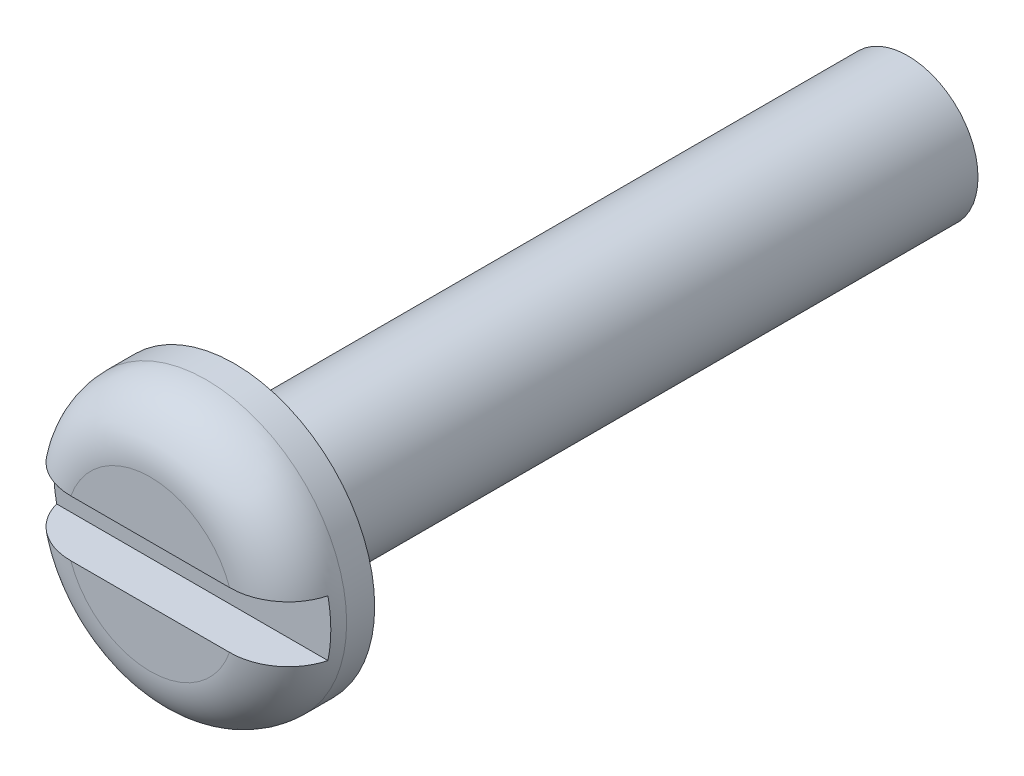
ISO-10303-21;
HEADER;
FILE_DESCRIPTION(('STEP AP214'),'2;1');
FILE_NAME('part.step','',(''),(''),'','','');
FILE_SCHEMA(('AUTOMOTIVE_DESIGN { 1 0 10303 214 1 1 1 1 }'));
ENDSEC;
DATA;
#1=APPLICATION_CONTEXT('core data for automotive mechanical design processes');
#2=APPLICATION_PROTOCOL_DEFINITION('international standard','automotive_design',2000,#1);
#3=PRODUCT_CONTEXT('',#1,'mechanical');
#4=PRODUCT('Part','Part','',(#3));
#5=PRODUCT_RELATED_PRODUCT_CATEGORY('part','',(#4));
#6=PRODUCT_DEFINITION_FORMATION('','',#4);
#7=PRODUCT_DEFINITION_CONTEXT('part definition',#1,'design');
#8=PRODUCT_DEFINITION('design','',#6,#7);
#9=PRODUCT_DEFINITION_SHAPE('','',#8);
#10=(LENGTH_UNIT() NAMED_UNIT(*) SI_UNIT(.MILLI.,.METRE.));
#11=(NAMED_UNIT(*) PLANE_ANGLE_UNIT() SI_UNIT($,.RADIAN.));
#12=(NAMED_UNIT(*) SI_UNIT($,.STERADIAN.) SOLID_ANGLE_UNIT());
#13=UNCERTAINTY_MEASURE_WITH_UNIT(LENGTH_MEASURE(1.E-05),#10,'distance_accuracy_value','');
#14=(GEOMETRIC_REPRESENTATION_CONTEXT(3) GLOBAL_UNCERTAINTY_ASSIGNED_CONTEXT((#13)) GLOBAL_UNIT_ASSIGNED_CONTEXT((#10,
#11,#12)) REPRESENTATION_CONTEXT('',''));
#15=CARTESIAN_POINT('',(0.,0.,0.));
#16=DIRECTION('',(0.,0.,1.));
#17=DIRECTION('',(1.,0.,0.));
#18=AXIS2_PLACEMENT_3D('',#15,#16,#17);
#19=CARTESIAN_POINT('',(0.,0.,1.5));
#20=DIRECTION('',(0.,0.,1.));
#21=DIRECTION('',(1.,0.,0.));
#22=AXIS2_PLACEMENT_3D('',#19,#20,#21);
#23=PLANE('',#22);
#24=DIRECTION('',(-1.,0.,0.));
#25=VECTOR('',#24,1.);
#26=CARTESIAN_POINT('',(-3.10291366643896,0.5,1.5));
#27=LINE('',#26,#25);
#28=CARTESIAN_POINT('',(1.41421356237309,0.5,1.5));
#29=VERTEX_POINT('',#28);
#30=CARTESIAN_POINT('',(-1.41421356237309,0.5,1.5));
#31=VERTEX_POINT('',#30);
#32=EDGE_CURVE('E103',#29,#31,#27,.T.);
#33=ORIENTED_EDGE('',*,*,#32,.F.);
#34=CARTESIAN_POINT('',(0.,0.,1.5));
#35=DIRECTION('',(0.,0.,1.));
#36=DIRECTION('',(1.,0.,0.));
#37=AXIS2_PLACEMENT_3D('',#34,#35,#36);
#38=CIRCLE('',#37,1.5);
#39=EDGE_CURVE('E109',#29,#31,#38,.T.);
#40=ORIENTED_EDGE('',*,*,#39,.T.);
#41=EDGE_LOOP('',(#33,#40));
#42=FACE_BOUND('',#41,.T.);
#43=ADVANCED_FACE('F41',(#42),#23,.T.);
#44=CARTESIAN_POINT('',(0.,0.,-12.));
#45=DIRECTION('',(0.,0.,1.));
#46=DIRECTION('',(1.,0.,0.));
#47=AXIS2_PLACEMENT_3D('',#44,#45,#46);
#48=CYLINDRICAL_SURFACE('',#47,1.25);
#49=CARTESIAN_POINT('',(0.,0.,-12.));
#50=DIRECTION('',(0.,0.,1.));
#51=DIRECTION('',(1.,0.,0.));
#52=AXIS2_PLACEMENT_3D('',#49,#50,#51);
#53=CIRCLE('',#52,1.25);
#54=CARTESIAN_POINT('',(1.25,0.,-12.));
#55=VERTEX_POINT('',#54);
#56=EDGE_CURVE('E110',#55,#55,#53,.T.);
#57=ORIENTED_EDGE('',*,*,#56,.T.);
#58=EDGE_LOOP('',(#57));
#59=FACE_BOUND('',#58,.T.);
#60=CARTESIAN_POINT('',(0.,0.,0.));
#61=DIRECTION('',(0.,0.,1.));
#62=DIRECTION('',(1.,0.,0.));
#63=AXIS2_PLACEMENT_3D('',#60,#61,#62);
#64=CIRCLE('',#63,1.25);
#65=CARTESIAN_POINT('',(1.25,0.,0.));
#66=VERTEX_POINT('',#65);
#67=EDGE_CURVE('E117',#66,#66,#64,.T.);
#68=ORIENTED_EDGE('',*,*,#67,.F.);
#69=EDGE_LOOP('',(#68));
#70=FACE_BOUND('',#69,.T.);
#71=ADVANCED_FACE('F176',(#59,#70),#48,.T.);
#72=CARTESIAN_POINT('',(0.,0.,-12.));
#73=DIRECTION('',(0.,0.,1.));
#74=DIRECTION('',(1.,0.,0.));
#75=AXIS2_PLACEMENT_3D('',#72,#73,#74);
#76=PLANE('',#75);
#77=ORIENTED_EDGE('',*,*,#56,.F.);
#78=EDGE_LOOP('',(#77));
#79=FACE_BOUND('',#78,.T.);
#80=ADVANCED_FACE('F178',(#79),#76,.F.);
#81=CARTESIAN_POINT('',(0.,0.,1.5));
#82=DIRECTION('',(0.,0.,-1.));
#83=DIRECTION('',(-1.,0.,0.));
#84=AXIS2_PLACEMENT_3D('',#81,#82,#83);
#85=CYLINDRICAL_SURFACE('',#84,2.5);
#86=CARTESIAN_POINT('',(0.,0.,0.5));
#87=DIRECTION('',(0.,0.,1.));
#88=DIRECTION('',(1.,0.,0.));
#89=AXIS2_PLACEMENT_3D('',#86,#87,#88);
#90=CIRCLE('',#89,2.5);
#91=CARTESIAN_POINT('',(2.5,0.,0.5));
#92=VERTEX_POINT('',#91);
#93=EDGE_CURVE('E115',#92,#92,#90,.F.);
#94=ORIENTED_EDGE('',*,*,#93,.T.);
#95=EDGE_LOOP('',(#94));
#96=FACE_BOUND('',#95,.T.);
#97=CARTESIAN_POINT('',(0.,0.,0.));
#98=DIRECTION('',(0.,0.,1.));
#99=DIRECTION('',(1.,0.,0.));
#100=AXIS2_PLACEMENT_3D('',#97,#98,#99);
#101=CIRCLE('',#100,2.5);
#102=CARTESIAN_POINT('',(2.5,0.,0.));
#103=VERTEX_POINT('',#102);
#104=EDGE_CURVE('E163',#103,#103,#101,.T.);
#105=ORIENTED_EDGE('',*,*,#104,.T.);
#106=EDGE_LOOP('',(#105));
#107=FACE_BOUND('',#106,.T.);
#108=ADVANCED_FACE('F184',(#96,#107),#85,.T.);
#109=DIRECTION('',(1.,0.,0.));
#110=VECTOR('',#109,1.);
#111=CARTESIAN_POINT('',(-3.10291366643896,-0.5,1.5));
#112=LINE('',#111,#110);
#113=CARTESIAN_POINT('',(-1.41421356237309,-0.5,1.5));
#114=VERTEX_POINT('',#113);
#115=CARTESIAN_POINT('',(1.41421356237309,-0.5,1.5));
#116=VERTEX_POINT('',#115);
#117=EDGE_CURVE('E89',#114,#116,#112,.T.);
#118=ORIENTED_EDGE('',*,*,#117,.F.);
#119=EDGE_CURVE('E101',#114,#116,#38,.T.);
#120=ORIENTED_EDGE('',*,*,#119,.T.);
#121=EDGE_LOOP('',(#118,#120));
#122=FACE_BOUND('',#121,.T.);
#123=ADVANCED_FACE('F100',(#122),#23,.T.);
#124=CARTESIAN_POINT('',(0.,0.,0.));
#125=DIRECTION('',(0.,0.,1.));
#126=DIRECTION('',(1.,0.,0.));
#127=AXIS2_PLACEMENT_3D('',#124,#125,#126);
#128=PLANE('',#127);
#129=ORIENTED_EDGE('',*,*,#67,.T.);
#130=EDGE_LOOP('',(#129));
#131=FACE_BOUND('',#130,.T.);
#132=ORIENTED_EDGE('',*,*,#104,.F.);
#133=EDGE_LOOP('',(#132));
#134=FACE_BOUND('',#133,.T.);
#135=ADVANCED_FACE('F173',(#131,#134),#128,.F.);
#136=CARTESIAN_POINT('',(0.,0.,0.5));
#137=DIRECTION('',(0.,0.,1.));
#138=DIRECTION('',(1.,0.,0.));
#139=AXIS2_PLACEMENT_3D('',#136,#137,#138);
#140=TOROIDAL_SURFACE('',#139,1.5,1.);
#141=CARTESIAN_POINT('',(0.,0.5,0.5));
#142=CARTESIAN_POINT('',(0.00121710493622152,0.5,0.501721284170827));
#143=CARTESIAN_POINT('',(0.00243426704448471,0.5,0.503442610685275));
#144=CARTESIAN_POINT('',(0.100816916781004,0.5,0.642569506493524));
#145=CARTESIAN_POINT('',(0.19848511571247,0.5,0.780124040271605));
#146=CARTESIAN_POINT('',(0.362031298498653,0.5,0.971868797124672));
#147=CARTESIAN_POINT('',(0.4192098250689,0.5,1.03320610876618));
#148=CARTESIAN_POINT('',(0.540770271724347,0.5,1.14817563642421));
#149=CARTESIAN_POINT('',(0.605135463772196,0.5,1.20182510822939));
#150=CARTESIAN_POINT('',(0.729814156922116,0.5,1.29008181339765));
#151=CARTESIAN_POINT('',(0.788920336433022,0.5,1.32637714685597));
#152=CARTESIAN_POINT('',(0.912013054850255,0.5,1.38986957810976));
#153=CARTESIAN_POINT('',(0.976006791325585,0.5,1.41705292727275));
#154=CARTESIAN_POINT('',(1.10800568500184,0.5,1.46070915202017));
#155=CARTESIAN_POINT('',(1.17603152286702,0.5,1.47712044798345));
#156=CARTESIAN_POINT('',(1.31392262036084,0.5,1.49763885150411));
#157=CARTESIAN_POINT('',(1.38378673097097,0.5,1.50175346910928));
#158=CARTESIAN_POINT('',(1.52003733341302,0.5,1.49698123372873));
#159=CARTESIAN_POINT('',(1.58644259382081,0.5,1.4886536489599));
#160=CARTESIAN_POINT('',(1.71657123248023,0.5,1.45981594062758));
#161=CARTESIAN_POINT('',(1.78029543591354,0.5,1.43930959528109));
#162=CARTESIAN_POINT('',(1.89706279587225,0.5,1.38893401908855));
#163=CARTESIAN_POINT('',(1.95054994400044,0.5,1.36009059230055));
#164=CARTESIAN_POINT('',(2.05157198720063,0.5,1.29339223216359));
#165=CARTESIAN_POINT('',(2.09910918821342,0.5,1.25554080652784));
#166=CARTESIAN_POINT('',(2.18445035545179,0.5,1.17398529229688));
#167=CARTESIAN_POINT('',(2.22261878662205,0.5,1.13066203234144));
#168=CARTESIAN_POINT('',(2.29090494932317,0.5,1.0380777244131));
#169=CARTESIAN_POINT('',(2.32102415140193,0.5,0.988817763430664));
#170=CARTESIAN_POINT('',(2.3715692607391,0.5,0.887160113287818));
#171=CARTESIAN_POINT('',(2.39222774369869,0.5,0.834877944261207));
#172=CARTESIAN_POINT('',(2.42434741686294,0.5,0.727556808609749));
#173=CARTESIAN_POINT('',(2.43580869998492,0.5,0.672517869841913));
#174=CARTESIAN_POINT('',(2.44908815114489,0.5,0.562001592991649));
#175=CARTESIAN_POINT('',(2.45102713889442,0.5,0.506538739255358));
#176=CARTESIAN_POINT('',(2.44553181756062,0.5,0.396091964343422));
#177=CARTESIAN_POINT('',(2.43809968018801,0.5,0.341107935175559));
#178=CARTESIAN_POINT('',(2.41413245274094,0.5,0.233358149438304));
#179=CARTESIAN_POINT('',(2.3976284357353,0.5,0.180585478880079));
#180=CARTESIAN_POINT('',(2.3560377030093,0.5,0.0785263038597564));
#181=CARTESIAN_POINT('',(2.33094788255322,0.5,0.0292410682895098));
#182=CARTESIAN_POINT('',(2.27277228964982,0.5,-0.0647207161002362));
#183=CARTESIAN_POINT('',(2.23964844613928,0.5,-0.109373831626207));
#184=CARTESIAN_POINT('',(2.18480553519818,0.5,-0.171751937348136));
#185=CARTESIAN_POINT('',(2.16565272100757,0.5,-0.191787759705729));
#186=CARTESIAN_POINT('',(2.12576099700987,0.5,-0.230210938042076));
#187=CARTESIAN_POINT('',(2.10502216919978,0.5,-0.248598379135615));
#188=CARTESIAN_POINT('',(2.08355429848249,0.5,-0.266111052226493));
#189=B_SPLINE_CURVE_WITH_KNOTS('',3,(#141,#142,#143,#144,#145,#146,#147,#148,#149,#150,#151,
#152,#153,#154,#155,#156,#157,#158,#159,#160,#161,#162,#163,#164,#165,#166,#167,#168,#169,#170,
#171,#172,#173,#174,#175,#176,#177,#178,#179,#180,#181,#182,#183,#184,#185,#186,#187,#188),
.UNSPECIFIED.,.F.,.F.,(4,2,2,2,2,2,2,2,2,2,2,2,2,2,2,2,2,2,2,2,2,2,2,4),(0.,0.00632455532040701,
0.511177739597177,0.762249343851845,1.01274826726215,1.2201609245296,1.42788514264277,
1.63678672953122,1.84556070619857,2.04522840835514,2.24483419993125,2.4262154029256,
2.60752609134629,2.77989258609502,2.95222756891491,3.12006252454541,3.28789578455456,
3.45359395953182,3.61925374185417,3.7843496092279,3.94950524056469,4.11545933900516,
4.19853060311015,4.28159757532561),.UNSPECIFIED.);
#190=CARTESIAN_POINT('',(2.41707209442655,0.5,0.75));
#191=VERTEX_POINT('',#190);
#192=EDGE_CURVE('E11',#191,#29,#189,.F.);
#193=ORIENTED_EDGE('',*,*,#192,.F.);
#194=CARTESIAN_POINT('',(0.,0.,0.75));
#195=DIRECTION('',(0.,0.,-1.));
#196=DIRECTION('',(-1.,0.,0.));
#197=AXIS2_PLACEMENT_3D('',#194,#195,#196);
#198=CIRCLE('',#197,2.46824583655185);
#199=CARTESIAN_POINT('',(2.41707209442655,-0.5,0.75));
#200=VERTEX_POINT('',#199);
#201=EDGE_CURVE('E125',#200,#191,#198,.F.);
#202=ORIENTED_EDGE('',*,*,#201,.F.);
#203=CARTESIAN_POINT('',(0.,-0.5,0.5));
#204=CARTESIAN_POINT('',(0.00121710493622152,-0.5,0.501721284170827));
#205=CARTESIAN_POINT('',(0.00243426704448471,-0.5,0.503442610685275));
#206=CARTESIAN_POINT('',(0.100816916781004,-0.5,0.642569506493524));
#207=CARTESIAN_POINT('',(0.19848511571247,-0.5,0.780124040271605));
#208=CARTESIAN_POINT('',(0.362031298498653,-0.5,0.971868797124672));
#209=CARTESIAN_POINT('',(0.4192098250689,-0.5,1.03320610876618));
#210=CARTESIAN_POINT('',(0.540770271724347,-0.5,1.14817563642421));
#211=CARTESIAN_POINT('',(0.605135463772196,-0.5,1.20182510822939));
#212=CARTESIAN_POINT('',(0.729814156922116,-0.5,1.29008181339765));
#213=CARTESIAN_POINT('',(0.788920336433022,-0.5,1.32637714685597));
#214=CARTESIAN_POINT('',(0.912013054850255,-0.5,1.38986957810976));
#215=CARTESIAN_POINT('',(0.976006791325585,-0.5,1.41705292727275));
#216=CARTESIAN_POINT('',(1.10800568500184,-0.5,1.46070915202017));
#217=CARTESIAN_POINT('',(1.17603152286702,-0.5,1.47712044798345));
#218=CARTESIAN_POINT('',(1.31392262036084,-0.5,1.49763885150411));
#219=CARTESIAN_POINT('',(1.38378673097097,-0.5,1.50175346910928));
#220=CARTESIAN_POINT('',(1.52003733341302,-0.5,1.49698123372873));
#221=CARTESIAN_POINT('',(1.58644259382081,-0.5,1.4886536489599));
#222=CARTESIAN_POINT('',(1.71657123248023,-0.5,1.45981594062758));
#223=CARTESIAN_POINT('',(1.78029543591354,-0.5,1.43930959528109));
#224=CARTESIAN_POINT('',(1.89706279587225,-0.5,1.38893401908855));
#225=CARTESIAN_POINT('',(1.95054994400044,-0.5,1.36009059230055));
#226=CARTESIAN_POINT('',(2.05157198720063,-0.5,1.29339223216359));
#227=CARTESIAN_POINT('',(2.09910918821342,-0.5,1.25554080652784));
#228=CARTESIAN_POINT('',(2.18445035545179,-0.5,1.17398529229688));
#229=CARTESIAN_POINT('',(2.22261878662205,-0.5,1.13066203234144));
#230=CARTESIAN_POINT('',(2.29090494932317,-0.5,1.0380777244131));
#231=CARTESIAN_POINT('',(2.32102415140193,-0.5,0.988817763430664));
#232=CARTESIAN_POINT('',(2.3715692607391,-0.5,0.887160113287818));
#233=CARTESIAN_POINT('',(2.39222774369869,-0.5,0.834877944261207));
#234=CARTESIAN_POINT('',(2.42434741686294,-0.5,0.727556808609749));
#235=CARTESIAN_POINT('',(2.43580869998492,-0.5,0.672517869841913));
#236=CARTESIAN_POINT('',(2.44908815114489,-0.5,0.562001592991649));
#237=CARTESIAN_POINT('',(2.45102713889442,-0.5,0.506538739255358));
#238=CARTESIAN_POINT('',(2.44553181756062,-0.5,0.396091964343422));
#239=CARTESIAN_POINT('',(2.43809968018801,-0.5,0.341107935175559));
#240=CARTESIAN_POINT('',(2.41413245274094,-0.5,0.233358149438304));
#241=CARTESIAN_POINT('',(2.3976284357353,-0.5,0.180585478880079));
#242=CARTESIAN_POINT('',(2.3560377030093,-0.5,0.0785263038597564));
#243=CARTESIAN_POINT('',(2.33094788255322,-0.5,0.0292410682895098));
#244=CARTESIAN_POINT('',(2.27277228964982,-0.5,-0.0647207161002362));
#245=CARTESIAN_POINT('',(2.23964844613928,-0.5,-0.109373831626207));
#246=CARTESIAN_POINT('',(2.18480553519818,-0.5,-0.171751937348136));
#247=CARTESIAN_POINT('',(2.16565272100757,-0.5,-0.191787759705729));
#248=CARTESIAN_POINT('',(2.12576099700987,-0.5,-0.230210938042076));
#249=CARTESIAN_POINT('',(2.10502216919978,-0.5,-0.248598379135615));
#250=CARTESIAN_POINT('',(2.08355429848249,-0.5,-0.266111052226493));
#251=B_SPLINE_CURVE_WITH_KNOTS('',3,(#203,#204,#205,#206,#207,#208,#209,#210,#211,#212,#213,
#214,#215,#216,#217,#218,#219,#220,#221,#222,#223,#224,#225,#226,#227,#228,#229,#230,#231,#232,
#233,#234,#235,#236,#237,#238,#239,#240,#241,#242,#243,#244,#245,#246,#247,#248,#249,#250),
.UNSPECIFIED.,.F.,.F.,(4,2,2,2,2,2,2,2,2,2,2,2,2,2,2,2,2,2,2,2,2,2,2,4),(0.,0.00632455532040701,
0.511177739597177,0.762249343851845,1.01274826726215,1.2201609245296,1.42788514264277,
1.63678672953122,1.84556070619857,2.04522840835514,2.24483419993125,2.4262154029256,
2.60752609134629,2.77989258609502,2.95222756891491,3.12006252454541,3.28789578455456,
3.45359395953182,3.61925374185417,3.7843496092279,3.94950524056469,4.11545933900516,
4.19853060311015,4.28159757532561),.UNSPECIFIED.);
#252=EDGE_CURVE('E56',#116,#200,#251,.T.);
#253=ORIENTED_EDGE('',*,*,#252,.F.);
#254=ORIENTED_EDGE('',*,*,#119,.F.);
#255=CARTESIAN_POINT('',(0.,-0.5,0.5));
#256=CARTESIAN_POINT('',(-0.00121710493622152,-0.5,0.501721284170827));
#257=CARTESIAN_POINT('',(-0.00243426704448471,-0.5,0.503442610685275));
#258=CARTESIAN_POINT('',(-0.100816916781004,-0.5,0.642569506493524));
#259=CARTESIAN_POINT('',(-0.19848511571247,-0.5,0.780124040271605));
#260=CARTESIAN_POINT('',(-0.362031298498653,-0.5,0.971868797124672));
#261=CARTESIAN_POINT('',(-0.4192098250689,-0.5,1.03320610876618));
#262=CARTESIAN_POINT('',(-0.540770271724347,-0.5,1.14817563642421));
#263=CARTESIAN_POINT('',(-0.605135463772196,-0.5,1.20182510822939));
#264=CARTESIAN_POINT('',(-0.729814156922116,-0.5,1.29008181339765));
#265=CARTESIAN_POINT('',(-0.788920336433022,-0.5,1.32637714685597));
#266=CARTESIAN_POINT('',(-0.912013054850255,-0.5,1.38986957810976));
#267=CARTESIAN_POINT('',(-0.976006791325585,-0.5,1.41705292727275));
#268=CARTESIAN_POINT('',(-1.10800568500184,-0.5,1.46070915202017));
#269=CARTESIAN_POINT('',(-1.17603152286702,-0.5,1.47712044798345));
#270=CARTESIAN_POINT('',(-1.31392262036084,-0.5,1.49763885150411));
#271=CARTESIAN_POINT('',(-1.38378673097097,-0.5,1.50175346910928));
#272=CARTESIAN_POINT('',(-1.52003733341302,-0.5,1.49698123372873));
#273=CARTESIAN_POINT('',(-1.58644259382081,-0.5,1.4886536489599));
#274=CARTESIAN_POINT('',(-1.71657123248023,-0.5,1.45981594062758));
#275=CARTESIAN_POINT('',(-1.78029543591354,-0.5,1.43930959528109));
#276=CARTESIAN_POINT('',(-1.89706279587225,-0.5,1.38893401908855));
#277=CARTESIAN_POINT('',(-1.95054994400044,-0.5,1.36009059230055));
#278=CARTESIAN_POINT('',(-2.05157198720063,-0.5,1.29339223216359));
#279=CARTESIAN_POINT('',(-2.09910918821342,-0.5,1.25554080652784));
#280=CARTESIAN_POINT('',(-2.18445035545179,-0.5,1.17398529229688));
#281=CARTESIAN_POINT('',(-2.22261878662205,-0.5,1.13066203234144));
#282=CARTESIAN_POINT('',(-2.29090494932317,-0.5,1.0380777244131));
#283=CARTESIAN_POINT('',(-2.32102415140193,-0.5,0.988817763430664));
#284=CARTESIAN_POINT('',(-2.3715692607391,-0.5,0.887160113287818));
#285=CARTESIAN_POINT('',(-2.39222774369869,-0.5,0.834877944261207));
#286=CARTESIAN_POINT('',(-2.42434741686294,-0.5,0.727556808609749));
#287=CARTESIAN_POINT('',(-2.43580869998492,-0.5,0.672517869841913));
#288=CARTESIAN_POINT('',(-2.44908815114489,-0.5,0.562001592991649));
#289=CARTESIAN_POINT('',(-2.45102713889442,-0.5,0.506538739255358));
#290=CARTESIAN_POINT('',(-2.44553181756062,-0.5,0.396091964343422));
#291=CARTESIAN_POINT('',(-2.43809968018801,-0.5,0.341107935175559));
#292=CARTESIAN_POINT('',(-2.41413245274094,-0.5,0.233358149438304));
#293=CARTESIAN_POINT('',(-2.3976284357353,-0.5,0.180585478880079));
#294=CARTESIAN_POINT('',(-2.3560377030093,-0.5,0.0785263038597564));
#295=CARTESIAN_POINT('',(-2.33094788255322,-0.5,0.0292410682895098));
#296=CARTESIAN_POINT('',(-2.27277228964982,-0.5,-0.0647207161002362));
#297=CARTESIAN_POINT('',(-2.23964844613928,-0.5,-0.109373831626207));
#298=CARTESIAN_POINT('',(-2.18480553519818,-0.5,-0.171751937348136));
#299=CARTESIAN_POINT('',(-2.16565272100757,-0.5,-0.191787759705729));
#300=CARTESIAN_POINT('',(-2.12576099700987,-0.5,-0.230210938042076));
#301=CARTESIAN_POINT('',(-2.10502216919978,-0.5,-0.248598379135615));
#302=CARTESIAN_POINT('',(-2.08355429848249,-0.5,-0.266111052226493));
#303=B_SPLINE_CURVE_WITH_KNOTS('',3,(#255,#256,#257,#258,#259,#260,#261,#262,#263,#264,#265,
#266,#267,#268,#269,#270,#271,#272,#273,#274,#275,#276,#277,#278,#279,#280,#281,#282,#283,#284,
#285,#286,#287,#288,#289,#290,#291,#292,#293,#294,#295,#296,#297,#298,#299,#300,#301,#302),
.UNSPECIFIED.,.F.,.F.,(4,2,2,2,2,2,2,2,2,2,2,2,2,2,2,2,2,2,2,2,2,2,2,4),(0.,0.00632455532040701,
0.511177739597177,0.762249343851845,1.01274826726215,1.2201609245296,1.42788514264277,
1.63678672953122,1.84556070619857,2.04522840835514,2.24483419993125,2.4262154029256,
2.60752609134629,2.77989258609502,2.95222756891491,3.12006252454541,3.28789578455456,
3.45359395953182,3.61925374185417,3.7843496092279,3.94950524056469,4.11545933900516,
4.19853060311015,4.28159757532561),.UNSPECIFIED.);
#304=CARTESIAN_POINT('',(-2.41707209442655,-0.5,0.75));
#305=VERTEX_POINT('',#304);
#306=EDGE_CURVE('E86',#305,#114,#303,.F.);
#307=ORIENTED_EDGE('',*,*,#306,.F.);
#308=CARTESIAN_POINT('',(-2.41707209442655,0.5,0.75));
#309=VERTEX_POINT('',#308);
#310=EDGE_CURVE('E96',#309,#305,#198,.F.);
#311=ORIENTED_EDGE('',*,*,#310,.F.);
#312=CARTESIAN_POINT('',(0.,0.5,0.5));
#313=CARTESIAN_POINT('',(-0.00121710493622152,0.5,0.501721284170827));
#314=CARTESIAN_POINT('',(-0.00243426704448471,0.5,0.503442610685275));
#315=CARTESIAN_POINT('',(-0.100816916781004,0.5,0.642569506493524));
#316=CARTESIAN_POINT('',(-0.19848511571247,0.5,0.780124040271605));
#317=CARTESIAN_POINT('',(-0.362031298498653,0.5,0.971868797124672));
#318=CARTESIAN_POINT('',(-0.4192098250689,0.5,1.03320610876618));
#319=CARTESIAN_POINT('',(-0.540770271724347,0.5,1.14817563642421));
#320=CARTESIAN_POINT('',(-0.605135463772196,0.5,1.20182510822939));
#321=CARTESIAN_POINT('',(-0.729814156922116,0.5,1.29008181339765));
#322=CARTESIAN_POINT('',(-0.788920336433022,0.5,1.32637714685597));
#323=CARTESIAN_POINT('',(-0.912013054850255,0.5,1.38986957810976));
#324=CARTESIAN_POINT('',(-0.976006791325585,0.5,1.41705292727275));
#325=CARTESIAN_POINT('',(-1.10800568500184,0.5,1.46070915202017));
#326=CARTESIAN_POINT('',(-1.17603152286702,0.5,1.47712044798345));
#327=CARTESIAN_POINT('',(-1.31392262036084,0.5,1.49763885150411));
#328=CARTESIAN_POINT('',(-1.38378673097097,0.5,1.50175346910928));
#329=CARTESIAN_POINT('',(-1.52003733341302,0.5,1.49698123372873));
#330=CARTESIAN_POINT('',(-1.58644259382081,0.5,1.4886536489599));
#331=CARTESIAN_POINT('',(-1.71657123248023,0.5,1.45981594062758));
#332=CARTESIAN_POINT('',(-1.78029543591354,0.5,1.43930959528109));
#333=CARTESIAN_POINT('',(-1.89706279587225,0.5,1.38893401908855));
#334=CARTESIAN_POINT('',(-1.95054994400044,0.5,1.36009059230055));
#335=CARTESIAN_POINT('',(-2.05157198720063,0.5,1.29339223216359));
#336=CARTESIAN_POINT('',(-2.09910918821342,0.5,1.25554080652784));
#337=CARTESIAN_POINT('',(-2.18445035545179,0.5,1.17398529229688));
#338=CARTESIAN_POINT('',(-2.22261878662205,0.5,1.13066203234144));
#339=CARTESIAN_POINT('',(-2.29090494932317,0.5,1.0380777244131));
#340=CARTESIAN_POINT('',(-2.32102415140193,0.5,0.988817763430664));
#341=CARTESIAN_POINT('',(-2.3715692607391,0.5,0.887160113287818));
#342=CARTESIAN_POINT('',(-2.39222774369869,0.5,0.834877944261207));
#343=CARTESIAN_POINT('',(-2.42434741686294,0.5,0.727556808609749));
#344=CARTESIAN_POINT('',(-2.43580869998492,0.5,0.672517869841913));
#345=CARTESIAN_POINT('',(-2.44908815114489,0.5,0.562001592991649));
#346=CARTESIAN_POINT('',(-2.45102713889442,0.5,0.506538739255358));
#347=CARTESIAN_POINT('',(-2.44553181756062,0.5,0.396091964343422));
#348=CARTESIAN_POINT('',(-2.43809968018801,0.5,0.341107935175559));
#349=CARTESIAN_POINT('',(-2.41413245274094,0.5,0.233358149438304));
#350=CARTESIAN_POINT('',(-2.3976284357353,0.5,0.180585478880079));
#351=CARTESIAN_POINT('',(-2.3560377030093,0.5,0.0785263038597564));
#352=CARTESIAN_POINT('',(-2.33094788255322,0.5,0.0292410682895098));
#353=CARTESIAN_POINT('',(-2.27277228964982,0.5,-0.0647207161002362));
#354=CARTESIAN_POINT('',(-2.23964844613928,0.5,-0.109373831626207));
#355=CARTESIAN_POINT('',(-2.18480553519818,0.5,-0.171751937348136));
#356=CARTESIAN_POINT('',(-2.16565272100757,0.5,-0.191787759705729));
#357=CARTESIAN_POINT('',(-2.12576099700987,0.5,-0.230210938042076));
#358=CARTESIAN_POINT('',(-2.10502216919978,0.5,-0.248598379135615));
#359=CARTESIAN_POINT('',(-2.08355429848249,0.5,-0.266111052226493));
#360=B_SPLINE_CURVE_WITH_KNOTS('',3,(#312,#313,#314,#315,#316,#317,#318,#319,#320,#321,#322,
#323,#324,#325,#326,#327,#328,#329,#330,#331,#332,#333,#334,#335,#336,#337,#338,#339,#340,#341,
#342,#343,#344,#345,#346,#347,#348,#349,#350,#351,#352,#353,#354,#355,#356,#357,#358,#359),
.UNSPECIFIED.,.F.,.F.,(4,2,2,2,2,2,2,2,2,2,2,2,2,2,2,2,2,2,2,2,2,2,2,4),(0.,0.00632455532040701,
0.511177739597177,0.762249343851845,1.01274826726215,1.2201609245296,1.42788514264277,
1.63678672953122,1.84556070619857,2.04522840835514,2.24483419993125,2.4262154029256,
2.60752609134629,2.77989258609502,2.95222756891491,3.12006252454541,3.28789578455456,
3.45359395953182,3.61925374185417,3.7843496092279,3.94950524056469,4.11545933900516,
4.19853060311015,4.28159757532561),.UNSPECIFIED.);
#361=EDGE_CURVE('E95',#31,#309,#360,.T.);
#362=ORIENTED_EDGE('',*,*,#361,.F.);
#363=ORIENTED_EDGE('',*,*,#39,.F.);
#364=EDGE_LOOP('',(#193,#202,#253,#254,#307,#311,#362,#363));
#365=FACE_BOUND('',#364,.T.);
#366=ORIENTED_EDGE('',*,*,#93,.F.);
#367=EDGE_LOOP('',(#366));
#368=FACE_BOUND('',#367,.T.);
#369=ADVANCED_FACE('F43',(#365,#368),#140,.T.);
#370=CARTESIAN_POINT('',(-3.10291366643896,0.5,0.75));
#371=DIRECTION('',(0.,1.,0.));
#372=DIRECTION('',(0.,0.,1.));
#373=AXIS2_PLACEMENT_3D('',#370,#371,#372);
#374=PLANE('',#373);
#375=ORIENTED_EDGE('',*,*,#361,.T.);
#376=DIRECTION('',(-1.,0.,0.));
#377=VECTOR('',#376,1.);
#378=CARTESIAN_POINT('',(-3.10291366643896,0.5,0.75));
#379=LINE('',#378,#377);
#380=EDGE_CURVE('E63',#191,#309,#379,.T.);
#381=ORIENTED_EDGE('',*,*,#380,.F.);
#382=ORIENTED_EDGE('',*,*,#192,.T.);
#383=ORIENTED_EDGE('',*,*,#32,.T.);
#384=EDGE_LOOP('',(#375,#381,#382,#383));
#385=FACE_BOUND('',#384,.T.);
#386=ADVANCED_FACE('F140',(#385),#374,.F.);
#387=CARTESIAN_POINT('',(-3.10291366643896,-0.5,0.75));
#388=DIRECTION('',(0.,-1.,0.));
#389=DIRECTION('',(0.,0.,-1.));
#390=AXIS2_PLACEMENT_3D('',#387,#388,#389);
#391=PLANE('',#390);
#392=ORIENTED_EDGE('',*,*,#252,.T.);
#393=DIRECTION('',(1.,0.,0.));
#394=VECTOR('',#393,1.);
#395=CARTESIAN_POINT('',(-3.10291366643896,-0.5,0.75));
#396=LINE('',#395,#394);
#397=EDGE_CURVE('E90',#305,#200,#396,.T.);
#398=ORIENTED_EDGE('',*,*,#397,.F.);
#399=ORIENTED_EDGE('',*,*,#306,.T.);
#400=ORIENTED_EDGE('',*,*,#117,.T.);
#401=EDGE_LOOP('',(#392,#398,#399,#400));
#402=FACE_BOUND('',#401,.T.);
#403=ADVANCED_FACE('F88',(#402),#391,.F.);
#404=CARTESIAN_POINT('',(0.,0.,0.75));
#405=DIRECTION('',(0.,0.,-1.));
#406=DIRECTION('',(-1.,0.,0.));
#407=AXIS2_PLACEMENT_3D('',#404,#405,#406);
#408=PLANE('',#407);
#409=ORIENTED_EDGE('',*,*,#201,.T.);
#410=ORIENTED_EDGE('',*,*,#380,.T.);
#411=ORIENTED_EDGE('',*,*,#310,.T.);
#412=ORIENTED_EDGE('',*,*,#397,.T.);
#413=EDGE_LOOP('',(#409,#410,#411,#412));
#414=FACE_BOUND('',#413,.T.);
#415=ADVANCED_FACE('F139',(#414),#408,.F.);
#416=CLOSED_SHELL('',(#43,#71,#80,#108,#123,#135,#369,#386,#403,#415));
#417=MANIFOLD_SOLID_BREP('B2',#416);
#418=ADVANCED_BREP_SHAPE_REPRESENTATION('',(#18,#417),#14);
#419=SHAPE_DEFINITION_REPRESENTATION(#9,#418);
ENDSEC;
END-ISO-10303-21;
